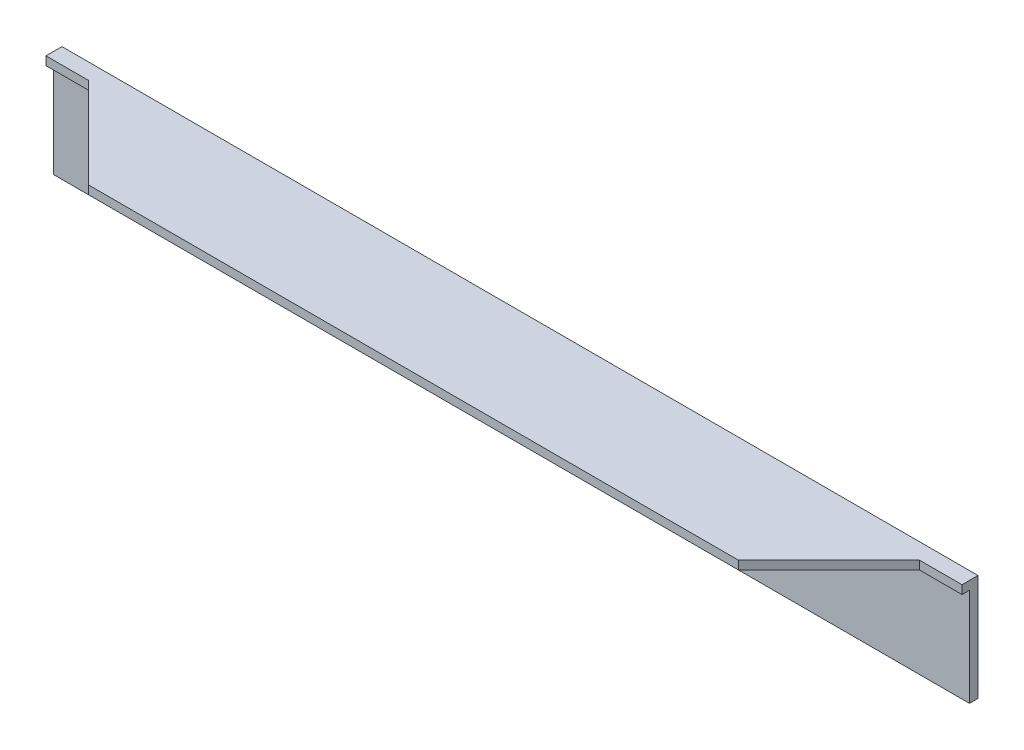
ISO-10303-21;
HEADER;
FILE_DESCRIPTION(('STEP AP214'),'2;1');
FILE_NAME('part.step','',(''),(''),'','','');
FILE_SCHEMA(('AUTOMOTIVE_DESIGN { 1 0 10303 214 1 1 1 1 }'));
ENDSEC;
DATA;
#1=APPLICATION_CONTEXT('core data for automotive mechanical design processes');
#2=APPLICATION_PROTOCOL_DEFINITION('international standard','automotive_design',2000,#1);
#3=PRODUCT_CONTEXT('',#1,'mechanical');
#4=PRODUCT('Part','Part','',(#3));
#5=PRODUCT_RELATED_PRODUCT_CATEGORY('part','',(#4));
#6=PRODUCT_DEFINITION_FORMATION('','',#4);
#7=PRODUCT_DEFINITION_CONTEXT('part definition',#1,'design');
#8=PRODUCT_DEFINITION('design','',#6,#7);
#9=PRODUCT_DEFINITION_SHAPE('','',#8);
#10=(LENGTH_UNIT() NAMED_UNIT(*) SI_UNIT(.MILLI.,.METRE.));
#11=(NAMED_UNIT(*) PLANE_ANGLE_UNIT() SI_UNIT($,.RADIAN.));
#12=(NAMED_UNIT(*) SI_UNIT($,.STERADIAN.) SOLID_ANGLE_UNIT());
#13=UNCERTAINTY_MEASURE_WITH_UNIT(LENGTH_MEASURE(1.E-05),#10,'distance_accuracy_value','');
#14=(GEOMETRIC_REPRESENTATION_CONTEXT(3) GLOBAL_UNCERTAINTY_ASSIGNED_CONTEXT((#13)) GLOBAL_UNIT_ASSIGNED_CONTEXT((#10,
#11,#12)) REPRESENTATION_CONTEXT('',''));
#15=CARTESIAN_POINT('',(0.,0.,0.));
#16=DIRECTION('',(0.,0.,1.));
#17=DIRECTION('',(1.,0.,0.));
#18=AXIS2_PLACEMENT_3D('',#15,#16,#17);
#19=CARTESIAN_POINT('',(430.,0.,8.));
#20=DIRECTION('',(-1.,0.,0.));
#21=DIRECTION('',(0.,0.,1.));
#22=AXIS2_PLACEMENT_3D('',#19,#20,#21);
#23=PLANE('',#22);
#24=DIRECTION('',(0.,1.,0.));
#25=VECTOR('',#24,1.);
#26=CARTESIAN_POINT('',(430.000000000004,-2.50000062179678E-05,15.));
#27=LINE('',#26,#25);
#28=CARTESIAN_POINT('',(430.000000000004,91.9999999999969,15.));
#29=VERTEX_POINT('',#28);
#30=CARTESIAN_POINT('',(430.000000000004,99.9999999999969,15.));
#31=VERTEX_POINT('',#30);
#32=EDGE_CURVE('E112',#29,#31,#27,.T.);
#33=ORIENTED_EDGE('',*,*,#32,.F.);
#34=DIRECTION('',(0.,0.,-1.));
#35=VECTOR('',#34,1.);
#36=CARTESIAN_POINT('',(429.999999999999,91.9999999999969,100.));
#37=LINE('',#36,#35);
#38=CARTESIAN_POINT('',(429.999999999999,91.9999999999969,8.));
#39=VERTEX_POINT('',#38);
#40=EDGE_CURVE('E191',#29,#39,#37,.T.);
#41=ORIENTED_EDGE('',*,*,#40,.T.);
#42=DIRECTION('',(0.,1.,0.));
#43=VECTOR('',#42,1.);
#44=CARTESIAN_POINT('',(430.,0.,8.));
#45=LINE('',#44,#43);
#46=CARTESIAN_POINT('',(430.,0.,8.));
#47=VERTEX_POINT('',#46);
#48=EDGE_CURVE('E139',#47,#39,#45,.T.);
#49=ORIENTED_EDGE('',*,*,#48,.F.);
#50=DIRECTION('',(0.,0.,-1.));
#51=VECTOR('',#50,1.);
#52=CARTESIAN_POINT('',(430.,0.,8.));
#53=LINE('',#52,#51);
#54=CARTESIAN_POINT('',(430.,0.,0.));
#55=VERTEX_POINT('',#54);
#56=EDGE_CURVE('E134',#47,#55,#53,.T.);
#57=ORIENTED_EDGE('',*,*,#56,.T.);
#58=DIRECTION('',(0.,1.,0.));
#59=VECTOR('',#58,1.);
#60=CARTESIAN_POINT('',(430.,0.,0.));
#61=LINE('',#60,#59);
#62=CARTESIAN_POINT('',(430.,100.,0.));
#63=VERTEX_POINT('',#62);
#64=EDGE_CURVE('E132',#55,#63,#61,.T.);
#65=ORIENTED_EDGE('',*,*,#64,.T.);
#66=DIRECTION('',(0.,0.,-1.));
#67=VECTOR('',#66,1.);
#68=CARTESIAN_POINT('',(430.,100.,8.));
#69=LINE('',#68,#67);
#70=EDGE_CURVE('E126',#31,#63,#69,.T.);
#71=ORIENTED_EDGE('',*,*,#70,.F.);
#72=EDGE_LOOP('',(#33,#41,#49,#57,#65,#71));
#73=FACE_BOUND('',#72,.T.);
#74=ADVANCED_FACE('F34',(#73),#23,.F.);
#75=CARTESIAN_POINT('',(430.,100.,8.));
#76=DIRECTION('',(0.,-1.,0.));
#77=DIRECTION('',(1.,0.,0.));
#78=AXIS2_PLACEMENT_3D('',#75,#76,#77);
#79=PLANE('',#78);
#80=DIRECTION('',(0.707106781186499,0.,-0.707106781186596));
#81=VECTOR('',#80,1.);
#82=CARTESIAN_POINT('',(389.999999999994,99.999999999997,14.9999999999932));
#83=LINE('',#82,#81);
#84=CARTESIAN_POINT('',(304.999999999999,99.9999999999969,100.));
#85=VERTEX_POINT('',#84);
#86=CARTESIAN_POINT('',(389.999999999994,99.999999999997,14.9999999999932));
#87=VERTEX_POINT('',#86);
#88=EDGE_CURVE('E49',#85,#87,#83,.T.);
#89=ORIENTED_EDGE('',*,*,#88,.T.);
#90=DIRECTION('',(1.,0.,1.70523317688477E-13));
#91=VECTOR('',#90,1.);
#92=CARTESIAN_POINT('',(430.000000000004,99.9999999999969,15.));
#93=LINE('',#92,#91);
#94=EDGE_CURVE('E116',#87,#31,#93,.T.);
#95=ORIENTED_EDGE('',*,*,#94,.T.);
#96=ORIENTED_EDGE('',*,*,#70,.T.);
#97=DIRECTION('',(-1.,0.,0.));
#98=VECTOR('',#97,1.);
#99=CARTESIAN_POINT('',(430.,100.,0.));
#100=LINE('',#99,#98);
#101=CARTESIAN_POINT('',(-430.000000000001,99.9999999999969,0.));
#102=VERTEX_POINT('',#101);
#103=EDGE_CURVE('E150',#63,#102,#100,.T.);
#104=ORIENTED_EDGE('',*,*,#103,.T.);
#105=DIRECTION('',(0.,0.,-1.));
#106=VECTOR('',#105,1.);
#107=CARTESIAN_POINT('',(-430.000000000001,99.9999999999969,8.));
#108=LINE('',#107,#106);
#109=CARTESIAN_POINT('',(-430.000000000004,99.9999999999969,15.));
#110=VERTEX_POINT('',#109);
#111=EDGE_CURVE('E135',#110,#102,#108,.T.);
#112=ORIENTED_EDGE('',*,*,#111,.F.);
#113=DIRECTION('',(-1.,0.,1.70523317688477E-13));
#114=VECTOR('',#113,1.);
#115=CARTESIAN_POINT('',(-430.000000000004,99.9999999999969,15.));
#116=LINE('',#115,#114);
#117=CARTESIAN_POINT('',(-389.999999999994,99.999999999997,14.9999999999932));
#118=VERTEX_POINT('',#117);
#119=EDGE_CURVE('E183',#118,#110,#116,.T.);
#120=ORIENTED_EDGE('',*,*,#119,.F.);
#121=DIRECTION('',(-0.707106781186499,0.,-0.707106781186596));
#122=VECTOR('',#121,1.);
#123=CARTESIAN_POINT('',(-389.999999999994,99.999999999997,14.9999999999932));
#124=LINE('',#123,#122);
#125=CARTESIAN_POINT('',(-304.999999999999,99.9999999999974,100.));
#126=VERTEX_POINT('',#125);
#127=EDGE_CURVE('E208',#126,#118,#124,.T.);
#128=ORIENTED_EDGE('',*,*,#127,.F.);
#129=DIRECTION('',(-1.,0.,0.));
#130=VECTOR('',#129,1.);
#131=CARTESIAN_POINT('',(-430.000000000001,99.9999999999969,100.));
#132=LINE('',#131,#130);
#133=EDGE_CURVE('E190',#85,#126,#132,.T.);
#134=ORIENTED_EDGE('',*,*,#133,.F.);
#135=EDGE_LOOP('',(#89,#95,#96,#104,#112,#120,#128,#134));
#136=FACE_BOUND('',#135,.T.);
#137=ADVANCED_FACE('F124',(#136),#79,.F.);
#138=CARTESIAN_POINT('',(-430.000000000001,91.9999999999969,100.));
#139=DIRECTION('',(0.,1.,0.));
#140=DIRECTION('',(0.,0.,1.));
#141=AXIS2_PLACEMENT_3D('',#138,#139,#140);
#142=PLANE('',#141);
#143=DIRECTION('',(0.707106781186499,0.,-0.707106781186596));
#144=VECTOR('',#143,1.);
#145=CARTESIAN_POINT('',(-62.4999999999507,91.9999999999969,467.5));
#146=LINE('',#145,#144);
#147=CARTESIAN_POINT('',(304.999999999999,91.9999999999969,100.));
#148=VERTEX_POINT('',#147);
#149=CARTESIAN_POINT('',(389.999999999994,91.9999999999969,14.9999999999932));
#150=VERTEX_POINT('',#149);
#151=EDGE_CURVE('E210',#148,#150,#146,.T.);
#152=ORIENTED_EDGE('',*,*,#151,.F.);
#153=DIRECTION('',(1.,0.,0.));
#154=VECTOR('',#153,1.);
#155=CARTESIAN_POINT('',(-430.000000000001,91.9999999999969,100.));
#156=LINE('',#155,#154);
#157=CARTESIAN_POINT('',(-304.999999999999,91.9999999999969,100.));
#158=VERTEX_POINT('',#157);
#159=EDGE_CURVE('E188',#158,#148,#156,.T.);
#160=ORIENTED_EDGE('',*,*,#159,.F.);
#161=DIRECTION('',(-0.707106781186499,0.,-0.707106781186596));
#162=VECTOR('',#161,1.);
#163=CARTESIAN_POINT('',(-367.499999999991,91.9999999999969,37.4999999999989));
#164=LINE('',#163,#162);
#165=CARTESIAN_POINT('',(-389.999999999994,91.9999999999969,14.9999999999932));
#166=VERTEX_POINT('',#165);
#167=EDGE_CURVE('E57',#158,#166,#164,.T.);
#168=ORIENTED_EDGE('',*,*,#167,.T.);
#169=DIRECTION('',(-1.,0.,1.70523317688477E-13));
#170=VECTOR('',#169,1.);
#171=CARTESIAN_POINT('',(-430.000000000015,91.9999999999969,15.));
#172=LINE('',#171,#170);
#173=CARTESIAN_POINT('',(-430.000000000004,91.9999999999969,15.));
#174=VERTEX_POINT('',#173);
#175=EDGE_CURVE('E203',#166,#174,#172,.T.);
#176=ORIENTED_EDGE('',*,*,#175,.T.);
#177=DIRECTION('',(0.,0.,-1.));
#178=VECTOR('',#177,1.);
#179=CARTESIAN_POINT('',(-430.000000000001,91.9999999999969,100.));
#180=LINE('',#179,#178);
#181=CARTESIAN_POINT('',(-430.000000000001,91.9999999999969,8.));
#182=VERTEX_POINT('',#181);
#183=EDGE_CURVE('E164',#174,#182,#180,.T.);
#184=ORIENTED_EDGE('',*,*,#183,.T.);
#185=DIRECTION('',(1.,0.,0.));
#186=VECTOR('',#185,1.);
#187=CARTESIAN_POINT('',(-430.000000000001,91.9999999999969,8.));
#188=LINE('',#187,#186);
#189=EDGE_CURVE('E181',#182,#39,#188,.T.);
#190=ORIENTED_EDGE('',*,*,#189,.T.);
#191=ORIENTED_EDGE('',*,*,#40,.F.);
#192=DIRECTION('',(1.,0.,1.70523317688477E-13));
#193=VECTOR('',#192,1.);
#194=CARTESIAN_POINT('',(-429.999999999986,91.9999999999969,14.9999999998534));
#195=LINE('',#194,#193);
#196=EDGE_CURVE('E11',#150,#29,#195,.T.);
#197=ORIENTED_EDGE('',*,*,#196,.F.);
#198=EDGE_LOOP('',(#152,#160,#168,#176,#184,#190,#191,#197));
#199=FACE_BOUND('',#198,.T.);
#200=ADVANCED_FACE('F216',(#199),#142,.F.);
#201=CARTESIAN_POINT('',(-430.000000000001,91.9999999999969,100.));
#202=DIRECTION('',(0.,0.,1.));
#203=DIRECTION('',(1.,0.,0.));
#204=AXIS2_PLACEMENT_3D('',#201,#202,#203);
#205=PLANE('',#204);
#206=ORIENTED_EDGE('',*,*,#159,.T.);
#207=DIRECTION('',(0.,1.,0.));
#208=VECTOR('',#207,1.);
#209=CARTESIAN_POINT('',(304.999999999999,91.9999999999942,100.));
#210=LINE('',#209,#208);
#211=EDGE_CURVE('E42',#148,#85,#210,.T.);
#212=ORIENTED_EDGE('',*,*,#211,.T.);
#213=ORIENTED_EDGE('',*,*,#133,.T.);
#214=DIRECTION('',(0.,1.,0.));
#215=VECTOR('',#214,1.);
#216=CARTESIAN_POINT('',(-304.999999999999,91.9999999999973,100.));
#217=LINE('',#216,#215);
#218=EDGE_CURVE('E145',#158,#126,#217,.T.);
#219=ORIENTED_EDGE('',*,*,#218,.F.);
#220=EDGE_LOOP('',(#206,#212,#213,#219));
#221=FACE_BOUND('',#220,.T.);
#222=ADVANCED_FACE('F231',(#221),#205,.T.);
#223=CARTESIAN_POINT('',(-430.,-3.10862446895044E-12,8.));
#224=DIRECTION('',(1.,0.,0.));
#225=DIRECTION('',(0.,1.,0.));
#226=AXIS2_PLACEMENT_3D('',#223,#224,#225);
#227=PLANE('',#226);
#228=ORIENTED_EDGE('',*,*,#183,.F.);
#229=DIRECTION('',(0.,1.,0.));
#230=VECTOR('',#229,1.);
#231=CARTESIAN_POINT('',(-430.000000000004,-2.50000062179678E-05,15.));
#232=LINE('',#231,#230);
#233=EDGE_CURVE('E176',#174,#110,#232,.T.);
#234=ORIENTED_EDGE('',*,*,#233,.T.);
#235=ORIENTED_EDGE('',*,*,#111,.T.);
#236=DIRECTION('',(0.,-1.,0.));
#237=VECTOR('',#236,1.);
#238=CARTESIAN_POINT('',(-430.,-3.10862446895044E-12,0.));
#239=LINE('',#238,#237);
#240=CARTESIAN_POINT('',(-430.,-3.10862446895044E-12,0.));
#241=VERTEX_POINT('',#240);
#242=EDGE_CURVE('E160',#102,#241,#239,.T.);
#243=ORIENTED_EDGE('',*,*,#242,.T.);
#244=DIRECTION('',(0.,0.,-1.));
#245=VECTOR('',#244,1.);
#246=CARTESIAN_POINT('',(-430.,-3.10862446895044E-12,8.));
#247=LINE('',#246,#245);
#248=CARTESIAN_POINT('',(-430.,-3.10862446895044E-12,8.));
#249=VERTEX_POINT('',#248);
#250=EDGE_CURVE('E137',#249,#241,#247,.T.);
#251=ORIENTED_EDGE('',*,*,#250,.F.);
#252=DIRECTION('',(0.,-1.,0.));
#253=VECTOR('',#252,1.);
#254=CARTESIAN_POINT('',(-430.,-3.10862446895044E-12,8.));
#255=LINE('',#254,#253);
#256=EDGE_CURVE('E146',#182,#249,#255,.T.);
#257=ORIENTED_EDGE('',*,*,#256,.F.);
#258=EDGE_LOOP('',(#228,#234,#235,#243,#251,#257));
#259=FACE_BOUND('',#258,.T.);
#260=ADVANCED_FACE('F36',(#259),#227,.F.);
#261=CARTESIAN_POINT('',(-430.,-3.10862446895044E-12,8.));
#262=DIRECTION('',(0.,1.,0.));
#263=DIRECTION('',(-1.,0.,0.));
#264=AXIS2_PLACEMENT_3D('',#261,#262,#263);
#265=PLANE('',#264);
#266=DIRECTION('',(1.,0.,0.));
#267=VECTOR('',#266,1.);
#268=CARTESIAN_POINT('',(-430.,-3.10862446895044E-12,0.));
#269=LINE('',#268,#267);
#270=EDGE_CURVE('E163',#241,#55,#269,.T.);
#271=ORIENTED_EDGE('',*,*,#270,.T.);
#272=ORIENTED_EDGE('',*,*,#56,.F.);
#273=DIRECTION('',(1.,0.,0.));
#274=VECTOR('',#273,1.);
#275=CARTESIAN_POINT('',(-430.,-3.10862446895044E-12,8.));
#276=LINE('',#275,#274);
#277=EDGE_CURVE('E149',#249,#47,#276,.T.);
#278=ORIENTED_EDGE('',*,*,#277,.F.);
#279=ORIENTED_EDGE('',*,*,#250,.T.);
#280=EDGE_LOOP('',(#271,#272,#278,#279));
#281=FACE_BOUND('',#280,.T.);
#282=ADVANCED_FACE('F224',(#281),#265,.F.);
#283=CARTESIAN_POINT('',(-430.000000000001,99.9999999999969,8.));
#284=DIRECTION('',(0.,0.,1.));
#285=DIRECTION('',(1.,0.,0.));
#286=AXIS2_PLACEMENT_3D('',#283,#284,#285);
#287=PLANE('',#286);
#288=ORIENTED_EDGE('',*,*,#189,.F.);
#289=ORIENTED_EDGE('',*,*,#256,.T.);
#290=ORIENTED_EDGE('',*,*,#277,.T.);
#291=ORIENTED_EDGE('',*,*,#48,.T.);
#292=EDGE_LOOP('',(#288,#289,#290,#291));
#293=FACE_BOUND('',#292,.T.);
#294=ADVANCED_FACE('F220',(#293),#287,.T.);
#295=CARTESIAN_POINT('',(-430.000000000001,99.9999999999969,0.));
#296=DIRECTION('',(0.,0.,1.));
#297=DIRECTION('',(1.,0.,0.));
#298=AXIS2_PLACEMENT_3D('',#295,#296,#297);
#299=PLANE('',#298);
#300=ORIENTED_EDGE('',*,*,#242,.F.);
#301=ORIENTED_EDGE('',*,*,#103,.F.);
#302=ORIENTED_EDGE('',*,*,#64,.F.);
#303=ORIENTED_EDGE('',*,*,#270,.F.);
#304=EDGE_LOOP('',(#300,#301,#302,#303));
#305=FACE_BOUND('',#304,.T.);
#306=ADVANCED_FACE('F170',(#305),#299,.F.);
#307=CARTESIAN_POINT('',(-430.000000000004,-2.50000062179678E-05,15.));
#308=DIRECTION('',(-1.70523317688477E-13,0.,-1.));
#309=DIRECTION('',(-1.,0.,1.70523317688477E-13));
#310=AXIS2_PLACEMENT_3D('',#307,#308,#309);
#311=PLANE('',#310);
#312=DIRECTION('',(0.,1.,0.));
#313=VECTOR('',#312,1.);
#314=CARTESIAN_POINT('',(-389.999999999993,-2.500000607919E-05,14.9999999999932));
#315=LINE('',#314,#313);
#316=EDGE_CURVE('E179',#166,#118,#315,.T.);
#317=ORIENTED_EDGE('',*,*,#316,.T.);
#318=ORIENTED_EDGE('',*,*,#119,.T.);
#319=ORIENTED_EDGE('',*,*,#233,.F.);
#320=ORIENTED_EDGE('',*,*,#175,.F.);
#321=EDGE_LOOP('',(#317,#318,#319,#320));
#322=FACE_BOUND('',#321,.T.);
#323=ADVANCED_FACE('F240',(#322),#311,.F.);
#324=CARTESIAN_POINT('',(-389.999999999993,-2.500000607919E-05,14.9999999999932));
#325=DIRECTION('',(0.707106781186596,0.,-0.707106781186499));
#326=DIRECTION('',(-0.707106781186499,0.,-0.707106781186596));
#327=AXIS2_PLACEMENT_3D('',#324,#325,#326);
#328=PLANE('',#327);
#329=ORIENTED_EDGE('',*,*,#218,.T.);
#330=ORIENTED_EDGE('',*,*,#127,.T.);
#331=ORIENTED_EDGE('',*,*,#316,.F.);
#332=ORIENTED_EDGE('',*,*,#167,.F.);
#333=EDGE_LOOP('',(#329,#330,#331,#332));
#334=FACE_BOUND('',#333,.T.);
#335=ADVANCED_FACE('F207',(#334),#328,.F.);
#336=CARTESIAN_POINT('',(430.000000000004,-2.50000062179678E-05,15.));
#337=DIRECTION('',(-1.70523317688477E-13,0.,1.));
#338=DIRECTION('',(1.,0.,1.70523317688477E-13));
#339=AXIS2_PLACEMENT_3D('',#336,#337,#338);
#340=PLANE('',#339);
#341=ORIENTED_EDGE('',*,*,#196,.T.);
#342=ORIENTED_EDGE('',*,*,#32,.T.);
#343=ORIENTED_EDGE('',*,*,#94,.F.);
#344=DIRECTION('',(0.,1.,0.));
#345=VECTOR('',#344,1.);
#346=CARTESIAN_POINT('',(389.999999999993,-2.500000607919E-05,14.9999999999932));
#347=LINE('',#346,#345);
#348=EDGE_CURVE('E121',#150,#87,#347,.T.);
#349=ORIENTED_EDGE('',*,*,#348,.F.);
#350=EDGE_LOOP('',(#341,#342,#343,#349));
#351=FACE_BOUND('',#350,.T.);
#352=ADVANCED_FACE('F114',(#351),#340,.T.);
#353=CARTESIAN_POINT('',(389.999999999993,-2.500000607919E-05,14.9999999999932));
#354=DIRECTION('',(0.707106781186596,0.,0.707106781186499));
#355=DIRECTION('',(0.707106781186499,0.,-0.707106781186596));
#356=AXIS2_PLACEMENT_3D('',#353,#354,#355);
#357=PLANE('',#356);
#358=ORIENTED_EDGE('',*,*,#151,.T.);
#359=ORIENTED_EDGE('',*,*,#348,.T.);
#360=ORIENTED_EDGE('',*,*,#88,.F.);
#361=ORIENTED_EDGE('',*,*,#211,.F.);
#362=EDGE_LOOP('',(#358,#359,#360,#361));
#363=FACE_BOUND('',#362,.T.);
#364=ADVANCED_FACE('F214',(#363),#357,.T.);
#365=CLOSED_SHELL('',(#74,#137,#200,#222,#260,#282,#294,#306,#323,#335,#352,#364));
#366=MANIFOLD_SOLID_BREP('B2',#365);
#367=ADVANCED_BREP_SHAPE_REPRESENTATION('',(#18,#366),#14);
#368=SHAPE_DEFINITION_REPRESENTATION(#9,#367);
ENDSEC;
END-ISO-10303-21;
